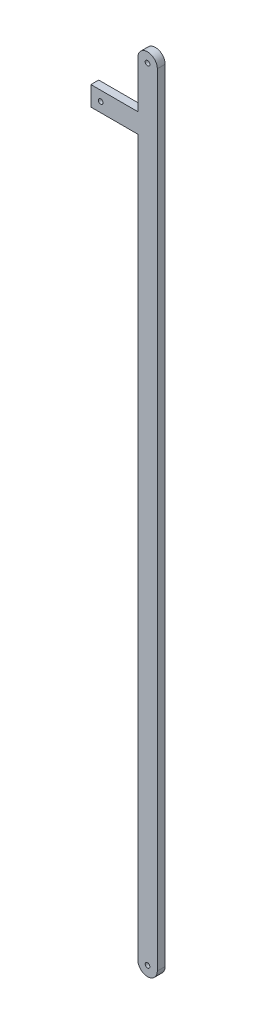
ISO-10303-21;
HEADER;
FILE_DESCRIPTION(('STEP AP214'),'2;1');
FILE_NAME('part.step','',(''),(''),'','','');
FILE_SCHEMA(('AUTOMOTIVE_DESIGN { 1 0 10303 214 1 1 1 1 }'));
ENDSEC;
DATA;
#1=APPLICATION_CONTEXT('core data for automotive mechanical design processes');
#2=APPLICATION_PROTOCOL_DEFINITION('international standard','automotive_design',2000,#1);
#3=PRODUCT_CONTEXT('',#1,'mechanical');
#4=PRODUCT('Part','Part','',(#3));
#5=PRODUCT_RELATED_PRODUCT_CATEGORY('part','',(#4));
#6=PRODUCT_DEFINITION_FORMATION('','',#4);
#7=PRODUCT_DEFINITION_CONTEXT('part definition',#1,'design');
#8=PRODUCT_DEFINITION('design','',#6,#7);
#9=PRODUCT_DEFINITION_SHAPE('','',#8);
#10=(LENGTH_UNIT() NAMED_UNIT(*) SI_UNIT(.MILLI.,.METRE.));
#11=(NAMED_UNIT(*) PLANE_ANGLE_UNIT() SI_UNIT($,.RADIAN.));
#12=(NAMED_UNIT(*) SI_UNIT($,.STERADIAN.) SOLID_ANGLE_UNIT());
#13=UNCERTAINTY_MEASURE_WITH_UNIT(LENGTH_MEASURE(1.E-05),#10,'distance_accuracy_value','');
#14=(GEOMETRIC_REPRESENTATION_CONTEXT(3) GLOBAL_UNCERTAINTY_ASSIGNED_CONTEXT((#13)) GLOBAL_UNIT_ASSIGNED_CONTEXT((#10,
#11,#12)) REPRESENTATION_CONTEXT('',''));
#15=CARTESIAN_POINT('',(0.,0.,0.));
#16=DIRECTION('',(0.,0.,1.));
#17=DIRECTION('',(1.,0.,0.));
#18=AXIS2_PLACEMENT_3D('',#15,#16,#17);
#19=CARTESIAN_POINT('',(0.,0.,10.));
#20=DIRECTION('',(0.,0.,1.));
#21=DIRECTION('',(1.,0.,0.));
#22=AXIS2_PLACEMENT_3D('',#19,#20,#21);
#23=PLANE('',#22);
#24=CARTESIAN_POINT('',(0.,-1000.,10.));
#25=DIRECTION('',(0.,0.,1.));
#26=DIRECTION('',(-1.,0.,0.));
#27=AXIS2_PLACEMENT_3D('',#24,#25,#26);
#28=CIRCLE('',#27,3.);
#29=CARTESIAN_POINT('',(-3.,-1000.,10.));
#30=VERTEX_POINT('',#29);
#31=EDGE_CURVE('E182',#30,#30,#28,.T.);
#32=ORIENTED_EDGE('',*,*,#31,.F.);
#33=EDGE_LOOP('',(#32));
#34=FACE_BOUND('',#33,.T.);
#35=CARTESIAN_POINT('',(0.,0.,10.));
#36=DIRECTION('',(0.,0.,1.));
#37=DIRECTION('',(1.,0.,0.));
#38=AXIS2_PLACEMENT_3D('',#35,#36,#37);
#39=CIRCLE('',#38,12.5);
#40=CARTESIAN_POINT('',(12.5,0.,10.));
#41=VERTEX_POINT('',#40);
#42=CARTESIAN_POINT('',(-12.5,0.,10.));
#43=VERTEX_POINT('',#42);
#44=EDGE_CURVE('E145',#41,#43,#39,.T.);
#45=ORIENTED_EDGE('',*,*,#44,.T.);
#46=DIRECTION('',(0.,-1.,0.));
#47=VECTOR('',#46,1.);
#48=CARTESIAN_POINT('',(-12.5,0.,10.));
#49=LINE('',#48,#47);
#50=CARTESIAN_POINT('',(-12.5,-60.,10.));
#51=VERTEX_POINT('',#50);
#52=EDGE_CURVE('E93',#43,#51,#49,.T.);
#53=ORIENTED_EDGE('',*,*,#52,.T.);
#54=DIRECTION('',(-1.,0.,0.));
#55=VECTOR('',#54,1.);
#56=CARTESIAN_POINT('',(-72.5,-60.,10.));
#57=LINE('',#56,#55);
#58=CARTESIAN_POINT('',(-72.5,-60.,10.));
#59=VERTEX_POINT('',#58);
#60=EDGE_CURVE('E160',#51,#59,#57,.T.);
#61=ORIENTED_EDGE('',*,*,#60,.T.);
#62=DIRECTION('',(0.,-1.,0.));
#63=VECTOR('',#62,1.);
#64=CARTESIAN_POINT('',(-72.5,-60.,10.));
#65=LINE('',#64,#63);
#66=CARTESIAN_POINT('',(-72.5,-85.,10.));
#67=VERTEX_POINT('',#66);
#68=EDGE_CURVE('E173',#59,#67,#65,.T.);
#69=ORIENTED_EDGE('',*,*,#68,.T.);
#70=DIRECTION('',(1.,0.,0.));
#71=VECTOR('',#70,1.);
#72=CARTESIAN_POINT('',(-72.5,-85.,10.));
#73=LINE('',#72,#71);
#74=CARTESIAN_POINT('',(-12.5,-85.,10.));
#75=VERTEX_POINT('',#74);
#76=EDGE_CURVE('E112',#67,#75,#73,.T.);
#77=ORIENTED_EDGE('',*,*,#76,.T.);
#78=DIRECTION('',(0.,-1.,0.));
#79=VECTOR('',#78,1.);
#80=CARTESIAN_POINT('',(-12.5,-85.,10.));
#81=LINE('',#80,#79);
#82=CARTESIAN_POINT('',(-12.4999999999999,-1000.,10.));
#83=VERTEX_POINT('',#82);
#84=EDGE_CURVE('E106',#75,#83,#81,.T.);
#85=ORIENTED_EDGE('',*,*,#84,.T.);
#86=CARTESIAN_POINT('',(0.,-1000.,10.));
#87=DIRECTION('',(0.,0.,1.));
#88=DIRECTION('',(-1.,0.,0.));
#89=AXIS2_PLACEMENT_3D('',#86,#87,#88);
#90=CIRCLE('',#89,12.4999999999999);
#91=CARTESIAN_POINT('',(12.4999999999999,-1000.,10.));
#92=VERTEX_POINT('',#91);
#93=EDGE_CURVE('E110',#83,#92,#90,.T.);
#94=ORIENTED_EDGE('',*,*,#93,.T.);
#95=DIRECTION('',(0.,1.,0.));
#96=VECTOR('',#95,1.);
#97=CARTESIAN_POINT('',(12.5,0.,10.));
#98=LINE('',#97,#96);
#99=EDGE_CURVE('E50',#92,#41,#98,.T.);
#100=ORIENTED_EDGE('',*,*,#99,.T.);
#101=EDGE_LOOP('',(#45,#53,#61,#69,#77,#85,#94,#100));
#102=FACE_BOUND('',#101,.T.);
#103=CARTESIAN_POINT('',(0.,0.,10.));
#104=DIRECTION('',(0.,0.,1.));
#105=DIRECTION('',(1.,0.,0.));
#106=AXIS2_PLACEMENT_3D('',#103,#104,#105);
#107=CIRCLE('',#106,3.);
#108=CARTESIAN_POINT('',(3.,0.,10.));
#109=VERTEX_POINT('',#108);
#110=EDGE_CURVE('E134',#109,#109,#107,.T.);
#111=ORIENTED_EDGE('',*,*,#110,.F.);
#112=EDGE_LOOP('',(#111));
#113=FACE_BOUND('',#112,.T.);
#114=CARTESIAN_POINT('',(-60.,-72.5,10.));
#115=DIRECTION('',(0.,0.,1.));
#116=DIRECTION('',(1.,0.,0.));
#117=AXIS2_PLACEMENT_3D('',#114,#115,#116);
#118=CIRCLE('',#117,3.00000000000001);
#119=CARTESIAN_POINT('',(-57.,-72.5,10.));
#120=VERTEX_POINT('',#119);
#121=EDGE_CURVE('E188',#120,#120,#118,.T.);
#122=ORIENTED_EDGE('',*,*,#121,.F.);
#123=EDGE_LOOP('',(#122));
#124=FACE_BOUND('',#123,.T.);
#125=ADVANCED_FACE('F33',(#34,#102,#113,#124),#23,.T.);
#126=CARTESIAN_POINT('',(0.,0.,0.));
#127=DIRECTION('',(0.,0.,1.));
#128=DIRECTION('',(1.,0.,0.));
#129=AXIS2_PLACEMENT_3D('',#126,#127,#128);
#130=PLANE('',#129);
#131=CARTESIAN_POINT('',(0.,0.,0.));
#132=DIRECTION('',(0.,0.,1.));
#133=DIRECTION('',(1.,0.,0.));
#134=AXIS2_PLACEMENT_3D('',#131,#132,#133);
#135=CIRCLE('',#134,12.5);
#136=CARTESIAN_POINT('',(12.5,0.,0.));
#137=VERTEX_POINT('',#136);
#138=CARTESIAN_POINT('',(-12.5,0.,0.));
#139=VERTEX_POINT('',#138);
#140=EDGE_CURVE('E130',#137,#139,#135,.T.);
#141=ORIENTED_EDGE('',*,*,#140,.F.);
#142=DIRECTION('',(0.,1.,0.));
#143=VECTOR('',#142,1.);
#144=CARTESIAN_POINT('',(12.5,0.,0.));
#145=LINE('',#144,#143);
#146=CARTESIAN_POINT('',(12.4999999999999,-1000.,0.));
#147=VERTEX_POINT('',#146);
#148=EDGE_CURVE('E85',#147,#137,#145,.T.);
#149=ORIENTED_EDGE('',*,*,#148,.F.);
#150=CARTESIAN_POINT('',(0.,-1000.,0.));
#151=DIRECTION('',(0.,0.,1.));
#152=DIRECTION('',(-1.,0.,0.));
#153=AXIS2_PLACEMENT_3D('',#150,#151,#152);
#154=CIRCLE('',#153,12.4999999999999);
#155=CARTESIAN_POINT('',(-12.4999999999999,-1000.,0.));
#156=VERTEX_POINT('',#155);
#157=EDGE_CURVE('E79',#156,#147,#154,.T.);
#158=ORIENTED_EDGE('',*,*,#157,.F.);
#159=DIRECTION('',(0.,-1.,0.));
#160=VECTOR('',#159,1.);
#161=CARTESIAN_POINT('',(-12.5,-85.,0.));
#162=LINE('',#161,#160);
#163=CARTESIAN_POINT('',(-12.5,-85.,0.));
#164=VERTEX_POINT('',#163);
#165=EDGE_CURVE('E120',#164,#156,#162,.T.);
#166=ORIENTED_EDGE('',*,*,#165,.F.);
#167=DIRECTION('',(1.,0.,0.));
#168=VECTOR('',#167,1.);
#169=CARTESIAN_POINT('',(-72.5,-85.,0.));
#170=LINE('',#169,#168);
#171=CARTESIAN_POINT('',(-72.5,-85.,0.));
#172=VERTEX_POINT('',#171);
#173=EDGE_CURVE('E140',#172,#164,#170,.T.);
#174=ORIENTED_EDGE('',*,*,#173,.F.);
#175=DIRECTION('',(0.,-1.,0.));
#176=VECTOR('',#175,1.);
#177=CARTESIAN_POINT('',(-72.5,-60.,0.));
#178=LINE('',#177,#176);
#179=CARTESIAN_POINT('',(-72.5,-60.,0.));
#180=VERTEX_POINT('',#179);
#181=EDGE_CURVE('E138',#180,#172,#178,.T.);
#182=ORIENTED_EDGE('',*,*,#181,.F.);
#183=DIRECTION('',(-1.,0.,0.));
#184=VECTOR('',#183,1.);
#185=CARTESIAN_POINT('',(-72.5,-60.,0.));
#186=LINE('',#185,#184);
#187=CARTESIAN_POINT('',(-12.5,-60.,0.));
#188=VERTEX_POINT('',#187);
#189=EDGE_CURVE('E136',#188,#180,#186,.T.);
#190=ORIENTED_EDGE('',*,*,#189,.F.);
#191=DIRECTION('',(0.,-1.,0.));
#192=VECTOR('',#191,1.);
#193=CARTESIAN_POINT('',(-12.5,0.,0.));
#194=LINE('',#193,#192);
#195=EDGE_CURVE('E133',#139,#188,#194,.T.);
#196=ORIENTED_EDGE('',*,*,#195,.F.);
#197=EDGE_LOOP('',(#141,#149,#158,#166,#174,#182,#190,#196));
#198=FACE_BOUND('',#197,.T.);
#199=CARTESIAN_POINT('',(0.,0.,0.));
#200=DIRECTION('',(0.,0.,1.));
#201=DIRECTION('',(1.,0.,0.));
#202=AXIS2_PLACEMENT_3D('',#199,#200,#201);
#203=CIRCLE('',#202,3.);
#204=CARTESIAN_POINT('',(3.,0.,0.));
#205=VERTEX_POINT('',#204);
#206=EDGE_CURVE('E179',#205,#205,#203,.T.);
#207=ORIENTED_EDGE('',*,*,#206,.T.);
#208=EDGE_LOOP('',(#207));
#209=FACE_BOUND('',#208,.T.);
#210=CARTESIAN_POINT('',(0.,-1000.,0.));
#211=DIRECTION('',(0.,0.,1.));
#212=DIRECTION('',(-1.,0.,0.));
#213=AXIS2_PLACEMENT_3D('',#210,#211,#212);
#214=CIRCLE('',#213,3.);
#215=CARTESIAN_POINT('',(-3.,-1000.,0.));
#216=VERTEX_POINT('',#215);
#217=EDGE_CURVE('E185',#216,#216,#214,.T.);
#218=ORIENTED_EDGE('',*,*,#217,.T.);
#219=EDGE_LOOP('',(#218));
#220=FACE_BOUND('',#219,.T.);
#221=CARTESIAN_POINT('',(-60.,-72.5,0.));
#222=DIRECTION('',(0.,0.,1.));
#223=DIRECTION('',(1.,0.,0.));
#224=AXIS2_PLACEMENT_3D('',#221,#222,#223);
#225=CIRCLE('',#224,3.00000000000001);
#226=CARTESIAN_POINT('',(-57.,-72.5,0.));
#227=VERTEX_POINT('',#226);
#228=EDGE_CURVE('E191',#227,#227,#225,.T.);
#229=ORIENTED_EDGE('',*,*,#228,.T.);
#230=EDGE_LOOP('',(#229));
#231=FACE_BOUND('',#230,.T.);
#232=ADVANCED_FACE('F164',(#198,#209,#220,#231),#130,.F.);
#233=CARTESIAN_POINT('',(0.,0.,10.));
#234=DIRECTION('',(0.,0.,-1.));
#235=DIRECTION('',(-1.,0.,0.));
#236=AXIS2_PLACEMENT_3D('',#233,#234,#235);
#237=CYLINDRICAL_SURFACE('',#236,12.5);
#238=ORIENTED_EDGE('',*,*,#140,.T.);
#239=DIRECTION('',(0.,0.,-1.));
#240=VECTOR('',#239,1.);
#241=CARTESIAN_POINT('',(-12.5,0.,10.));
#242=LINE('',#241,#240);
#243=EDGE_CURVE('E11',#43,#139,#242,.T.);
#244=ORIENTED_EDGE('',*,*,#243,.F.);
#245=ORIENTED_EDGE('',*,*,#44,.F.);
#246=DIRECTION('',(0.,0.,-1.));
#247=VECTOR('',#246,1.);
#248=CARTESIAN_POINT('',(12.5,0.,10.));
#249=LINE('',#248,#247);
#250=EDGE_CURVE('E126',#41,#137,#249,.T.);
#251=ORIENTED_EDGE('',*,*,#250,.T.);
#252=EDGE_LOOP('',(#238,#244,#245,#251));
#253=FACE_BOUND('',#252,.T.);
#254=ADVANCED_FACE('F35',(#253),#237,.T.);
#255=CARTESIAN_POINT('',(-12.5,0.,10.));
#256=DIRECTION('',(1.,0.,0.));
#257=DIRECTION('',(0.,1.,0.));
#258=AXIS2_PLACEMENT_3D('',#255,#256,#257);
#259=PLANE('',#258);
#260=ORIENTED_EDGE('',*,*,#195,.T.);
#261=DIRECTION('',(0.,0.,-1.));
#262=VECTOR('',#261,1.);
#263=CARTESIAN_POINT('',(-12.5,-60.,10.));
#264=LINE('',#263,#262);
#265=EDGE_CURVE('E42',#51,#188,#264,.T.);
#266=ORIENTED_EDGE('',*,*,#265,.F.);
#267=ORIENTED_EDGE('',*,*,#52,.F.);
#268=ORIENTED_EDGE('',*,*,#243,.T.);
#269=EDGE_LOOP('',(#260,#266,#267,#268));
#270=FACE_BOUND('',#269,.T.);
#271=ADVANCED_FACE('F224',(#270),#259,.F.);
#272=CARTESIAN_POINT('',(-72.5,-60.,10.));
#273=DIRECTION('',(0.,-1.,0.));
#274=DIRECTION('',(0.,0.,-1.));
#275=AXIS2_PLACEMENT_3D('',#272,#273,#274);
#276=PLANE('',#275);
#277=ORIENTED_EDGE('',*,*,#189,.T.);
#278=DIRECTION('',(0.,0.,-1.));
#279=VECTOR('',#278,1.);
#280=CARTESIAN_POINT('',(-72.5,-60.,10.));
#281=LINE('',#280,#279);
#282=EDGE_CURVE('E152',#59,#180,#281,.T.);
#283=ORIENTED_EDGE('',*,*,#282,.F.);
#284=ORIENTED_EDGE('',*,*,#60,.F.);
#285=ORIENTED_EDGE('',*,*,#265,.T.);
#286=EDGE_LOOP('',(#277,#283,#284,#285));
#287=FACE_BOUND('',#286,.T.);
#288=ADVANCED_FACE('F158',(#287),#276,.F.);
#289=CARTESIAN_POINT('',(-72.5,-60.,10.));
#290=DIRECTION('',(1.,0.,0.));
#291=DIRECTION('',(0.,1.,0.));
#292=AXIS2_PLACEMENT_3D('',#289,#290,#291);
#293=PLANE('',#292);
#294=ORIENTED_EDGE('',*,*,#181,.T.);
#295=DIRECTION('',(0.,0.,-1.));
#296=VECTOR('',#295,1.);
#297=CARTESIAN_POINT('',(-72.5,-85.,10.));
#298=LINE('',#297,#296);
#299=EDGE_CURVE('E149',#67,#172,#298,.T.);
#300=ORIENTED_EDGE('',*,*,#299,.F.);
#301=ORIENTED_EDGE('',*,*,#68,.F.);
#302=ORIENTED_EDGE('',*,*,#282,.T.);
#303=EDGE_LOOP('',(#294,#300,#301,#302));
#304=FACE_BOUND('',#303,.T.);
#305=ADVANCED_FACE('F169',(#304),#293,.F.);
#306=CARTESIAN_POINT('',(-72.5,-85.,10.));
#307=DIRECTION('',(0.,1.,0.));
#308=DIRECTION('',(0.,0.,1.));
#309=AXIS2_PLACEMENT_3D('',#306,#307,#308);
#310=PLANE('',#309);
#311=ORIENTED_EDGE('',*,*,#173,.T.);
#312=DIRECTION('',(0.,0.,-1.));
#313=VECTOR('',#312,1.);
#314=CARTESIAN_POINT('',(-12.5,-85.,10.));
#315=LINE('',#314,#313);
#316=EDGE_CURVE('E121',#75,#164,#315,.T.);
#317=ORIENTED_EDGE('',*,*,#316,.F.);
#318=ORIENTED_EDGE('',*,*,#76,.F.);
#319=ORIENTED_EDGE('',*,*,#299,.T.);
#320=EDGE_LOOP('',(#311,#317,#318,#319));
#321=FACE_BOUND('',#320,.T.);
#322=ADVANCED_FACE('F172',(#321),#310,.F.);
#323=CARTESIAN_POINT('',(-12.5,-85.,10.));
#324=DIRECTION('',(1.,0.,0.));
#325=DIRECTION('',(0.,1.,0.));
#326=AXIS2_PLACEMENT_3D('',#323,#324,#325);
#327=PLANE('',#326);
#328=ORIENTED_EDGE('',*,*,#165,.T.);
#329=DIRECTION('',(0.,0.,-1.));
#330=VECTOR('',#329,1.);
#331=CARTESIAN_POINT('',(-12.4999999999999,-1000.,10.));
#332=LINE('',#331,#330);
#333=EDGE_CURVE('E117',#83,#156,#332,.T.);
#334=ORIENTED_EDGE('',*,*,#333,.F.);
#335=ORIENTED_EDGE('',*,*,#84,.F.);
#336=ORIENTED_EDGE('',*,*,#316,.T.);
#337=EDGE_LOOP('',(#328,#334,#335,#336));
#338=FACE_BOUND('',#337,.T.);
#339=ADVANCED_FACE('F118',(#338),#327,.F.);
#340=CARTESIAN_POINT('',(0.,-1000.,10.));
#341=DIRECTION('',(0.,0.,-1.));
#342=DIRECTION('',(-1.,0.,0.));
#343=AXIS2_PLACEMENT_3D('',#340,#341,#342);
#344=CYLINDRICAL_SURFACE('',#343,12.4999999999999);
#345=ORIENTED_EDGE('',*,*,#157,.T.);
#346=DIRECTION('',(0.,0.,-1.));
#347=VECTOR('',#346,1.);
#348=CARTESIAN_POINT('',(12.4999999999999,-1000.,10.));
#349=LINE('',#348,#347);
#350=EDGE_CURVE('E122',#92,#147,#349,.T.);
#351=ORIENTED_EDGE('',*,*,#350,.F.);
#352=ORIENTED_EDGE('',*,*,#93,.F.);
#353=ORIENTED_EDGE('',*,*,#333,.T.);
#354=EDGE_LOOP('',(#345,#351,#352,#353));
#355=FACE_BOUND('',#354,.T.);
#356=ADVANCED_FACE('F124',(#355),#344,.T.);
#357=CARTESIAN_POINT('',(12.5,0.,10.));
#358=DIRECTION('',(-1.,0.,0.));
#359=DIRECTION('',(0.,-1.,0.));
#360=AXIS2_PLACEMENT_3D('',#357,#358,#359);
#361=PLANE('',#360);
#362=ORIENTED_EDGE('',*,*,#148,.T.);
#363=ORIENTED_EDGE('',*,*,#250,.F.);
#364=ORIENTED_EDGE('',*,*,#99,.F.);
#365=ORIENTED_EDGE('',*,*,#350,.T.);
#366=EDGE_LOOP('',(#362,#363,#364,#365));
#367=FACE_BOUND('',#366,.T.);
#368=ADVANCED_FACE('F212',(#367),#361,.F.);
#369=CARTESIAN_POINT('',(0.,0.,10.));
#370=DIRECTION('',(0.,0.,-1.));
#371=DIRECTION('',(-1.,0.,0.));
#372=AXIS2_PLACEMENT_3D('',#369,#370,#371);
#373=CYLINDRICAL_SURFACE('',#372,3.);
#374=ORIENTED_EDGE('',*,*,#110,.T.);
#375=EDGE_LOOP('',(#374));
#376=FACE_BOUND('',#375,.T.);
#377=ORIENTED_EDGE('',*,*,#206,.F.);
#378=EDGE_LOOP('',(#377));
#379=FACE_BOUND('',#378,.T.);
#380=ADVANCED_FACE('F209',(#376,#379),#373,.F.);
#381=CARTESIAN_POINT('',(0.,-1000.,10.));
#382=DIRECTION('',(0.,0.,-1.));
#383=DIRECTION('',(-1.,0.,0.));
#384=AXIS2_PLACEMENT_3D('',#381,#382,#383);
#385=CYLINDRICAL_SURFACE('',#384,3.);
#386=ORIENTED_EDGE('',*,*,#31,.T.);
#387=EDGE_LOOP('',(#386));
#388=FACE_BOUND('',#387,.T.);
#389=ORIENTED_EDGE('',*,*,#217,.F.);
#390=EDGE_LOOP('',(#389));
#391=FACE_BOUND('',#390,.T.);
#392=ADVANCED_FACE('F288',(#388,#391),#385,.F.);
#393=CARTESIAN_POINT('',(-60.,-72.5,10.));
#394=DIRECTION('',(0.,0.,-1.));
#395=DIRECTION('',(-1.,0.,0.));
#396=AXIS2_PLACEMENT_3D('',#393,#394,#395);
#397=CYLINDRICAL_SURFACE('',#396,3.00000000000001);
#398=ORIENTED_EDGE('',*,*,#121,.T.);
#399=EDGE_LOOP('',(#398));
#400=FACE_BOUND('',#399,.T.);
#401=ORIENTED_EDGE('',*,*,#228,.F.);
#402=EDGE_LOOP('',(#401));
#403=FACE_BOUND('',#402,.T.);
#404=ADVANCED_FACE('F197',(#400,#403),#397,.F.);
#405=CLOSED_SHELL('',(#125,#232,#254,#271,#288,#305,#322,#339,#356,#368,#380,#392,#404));
#406=MANIFOLD_SOLID_BREP('B2',#405);
#407=ADVANCED_BREP_SHAPE_REPRESENTATION('',(#18,#406),#14);
#408=SHAPE_DEFINITION_REPRESENTATION(#9,#407);
ENDSEC;
END-ISO-10303-21;
